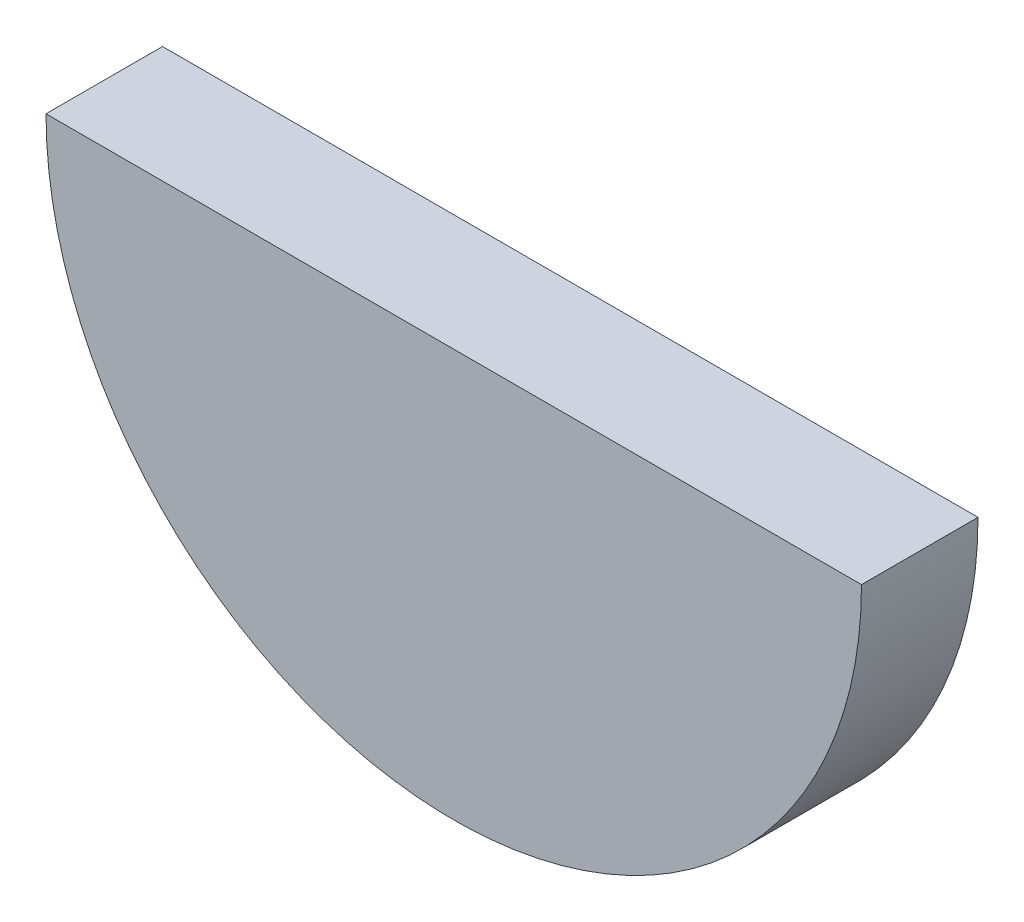
ISO-10303-21;
HEADER;
FILE_DESCRIPTION(('STEP AP214'),'2;1');
FILE_NAME('part.step','',(''),(''),'','','');
FILE_SCHEMA(('AUTOMOTIVE_DESIGN { 1 0 10303 214 1 1 1 1 }'));
ENDSEC;
DATA;
#1=APPLICATION_CONTEXT('core data for automotive mechanical design processes');
#2=APPLICATION_PROTOCOL_DEFINITION('international standard','automotive_design',2000,#1);
#3=PRODUCT_CONTEXT('',#1,'mechanical');
#4=PRODUCT('Part','Part','',(#3));
#5=PRODUCT_RELATED_PRODUCT_CATEGORY('part','',(#4));
#6=PRODUCT_DEFINITION_FORMATION('','',#4);
#7=PRODUCT_DEFINITION_CONTEXT('part definition',#1,'design');
#8=PRODUCT_DEFINITION('design','',#6,#7);
#9=PRODUCT_DEFINITION_SHAPE('','',#8);
#10=(LENGTH_UNIT() NAMED_UNIT(*) SI_UNIT(.MILLI.,.METRE.));
#11=(NAMED_UNIT(*) PLANE_ANGLE_UNIT() SI_UNIT($,.RADIAN.));
#12=(NAMED_UNIT(*) SI_UNIT($,.STERADIAN.) SOLID_ANGLE_UNIT());
#13=UNCERTAINTY_MEASURE_WITH_UNIT(LENGTH_MEASURE(1.E-05),#10,'distance_accuracy_value','');
#14=(GEOMETRIC_REPRESENTATION_CONTEXT(3) GLOBAL_UNCERTAINTY_ASSIGNED_CONTEXT((#13)) GLOBAL_UNIT_ASSIGNED_CONTEXT((#10,
#11,#12)) REPRESENTATION_CONTEXT('',''));
#15=CARTESIAN_POINT('',(0.,0.,0.));
#16=DIRECTION('',(0.,0.,1.));
#17=DIRECTION('',(1.,0.,0.));
#18=AXIS2_PLACEMENT_3D('',#15,#16,#17);
#19=CARTESIAN_POINT('',(0.,0.,6.35));
#20=DIRECTION('',(0.,0.,-1.));
#21=DIRECTION('',(-1.,0.,0.));
#22=AXIS2_PLACEMENT_3D('',#19,#20,#21);
#23=CYLINDRICAL_SURFACE('',#22,22.225);
#24=CARTESIAN_POINT('',(0.,0.,0.));
#25=DIRECTION('',(0.,0.,1.));
#26=DIRECTION('',(1.,0.,0.));
#27=AXIS2_PLACEMENT_3D('',#24,#25,#26);
#28=CIRCLE('',#27,22.225);
#29=CARTESIAN_POINT('',(-22.225,0.,0.));
#30=VERTEX_POINT('',#29);
#31=CARTESIAN_POINT('',(22.225,0.,0.));
#32=VERTEX_POINT('',#31);
#33=EDGE_CURVE('E63',#30,#32,#28,.T.);
#34=ORIENTED_EDGE('',*,*,#33,.T.);
#35=DIRECTION('',(0.,0.,-1.));
#36=VECTOR('',#35,1.);
#37=CARTESIAN_POINT('',(22.225,0.,6.35));
#38=LINE('',#37,#36);
#39=CARTESIAN_POINT('',(22.225,0.,6.35));
#40=VERTEX_POINT('',#39);
#41=EDGE_CURVE('E11',#40,#32,#38,.T.);
#42=ORIENTED_EDGE('',*,*,#41,.F.);
#43=CARTESIAN_POINT('',(0.,0.,6.35));
#44=DIRECTION('',(0.,0.,1.));
#45=DIRECTION('',(1.,0.,0.));
#46=AXIS2_PLACEMENT_3D('',#43,#44,#45);
#47=CIRCLE('',#46,22.225);
#48=CARTESIAN_POINT('',(-22.225,0.,6.35));
#49=VERTEX_POINT('',#48);
#50=EDGE_CURVE('E62',#49,#40,#47,.T.);
#51=ORIENTED_EDGE('',*,*,#50,.F.);
#52=DIRECTION('',(0.,0.,-1.));
#53=VECTOR('',#52,1.);
#54=CARTESIAN_POINT('',(-22.225,0.,6.35));
#55=LINE('',#54,#53);
#56=EDGE_CURVE('E40',#49,#30,#55,.T.);
#57=ORIENTED_EDGE('',*,*,#56,.T.);
#58=EDGE_LOOP('',(#34,#42,#51,#57));
#59=FACE_BOUND('',#58,.T.);
#60=ADVANCED_FACE('F32',(#59),#23,.T.);
#61=CARTESIAN_POINT('',(-22.225,0.,6.35));
#62=DIRECTION('',(0.,-1.,0.));
#63=DIRECTION('',(0.,0.,-1.));
#64=AXIS2_PLACEMENT_3D('',#61,#62,#63);
#65=PLANE('',#64);
#66=DIRECTION('',(-1.,0.,0.));
#67=VECTOR('',#66,1.);
#68=CARTESIAN_POINT('',(-22.225,0.,0.));
#69=LINE('',#68,#67);
#70=EDGE_CURVE('E55',#32,#30,#69,.T.);
#71=ORIENTED_EDGE('',*,*,#70,.T.);
#72=ORIENTED_EDGE('',*,*,#56,.F.);
#73=DIRECTION('',(-1.,0.,0.));
#74=VECTOR('',#73,1.);
#75=CARTESIAN_POINT('',(-22.225,0.,6.35));
#76=LINE('',#75,#74);
#77=EDGE_CURVE('E47',#40,#49,#76,.T.);
#78=ORIENTED_EDGE('',*,*,#77,.F.);
#79=ORIENTED_EDGE('',*,*,#41,.T.);
#80=EDGE_LOOP('',(#71,#72,#78,#79));
#81=FACE_BOUND('',#80,.T.);
#82=ADVANCED_FACE('F58',(#81),#65,.F.);
#83=CARTESIAN_POINT('',(0.,0.,6.35));
#84=DIRECTION('',(0.,0.,1.));
#85=DIRECTION('',(1.,0.,0.));
#86=AXIS2_PLACEMENT_3D('',#83,#84,#85);
#87=PLANE('',#86);
#88=ORIENTED_EDGE('',*,*,#50,.T.);
#89=ORIENTED_EDGE('',*,*,#77,.T.);
#90=EDGE_LOOP('',(#88,#89));
#91=FACE_BOUND('',#90,.T.);
#92=ADVANCED_FACE('F70',(#91),#87,.T.);
#93=CARTESIAN_POINT('',(0.,0.,0.));
#94=DIRECTION('',(0.,0.,1.));
#95=DIRECTION('',(1.,0.,0.));
#96=AXIS2_PLACEMENT_3D('',#93,#94,#95);
#97=PLANE('',#96);
#98=ORIENTED_EDGE('',*,*,#33,.F.);
#99=ORIENTED_EDGE('',*,*,#70,.F.);
#100=EDGE_LOOP('',(#98,#99));
#101=FACE_BOUND('',#100,.T.);
#102=ADVANCED_FACE('F66',(#101),#97,.F.);
#103=CLOSED_SHELL('',(#60,#82,#92,#102));
#104=MANIFOLD_SOLID_BREP('B2',#103);
#105=ADVANCED_BREP_SHAPE_REPRESENTATION('',(#18,#104),#14);
#106=SHAPE_DEFINITION_REPRESENTATION(#9,#105);
ENDSEC;
END-ISO-10303-21;
